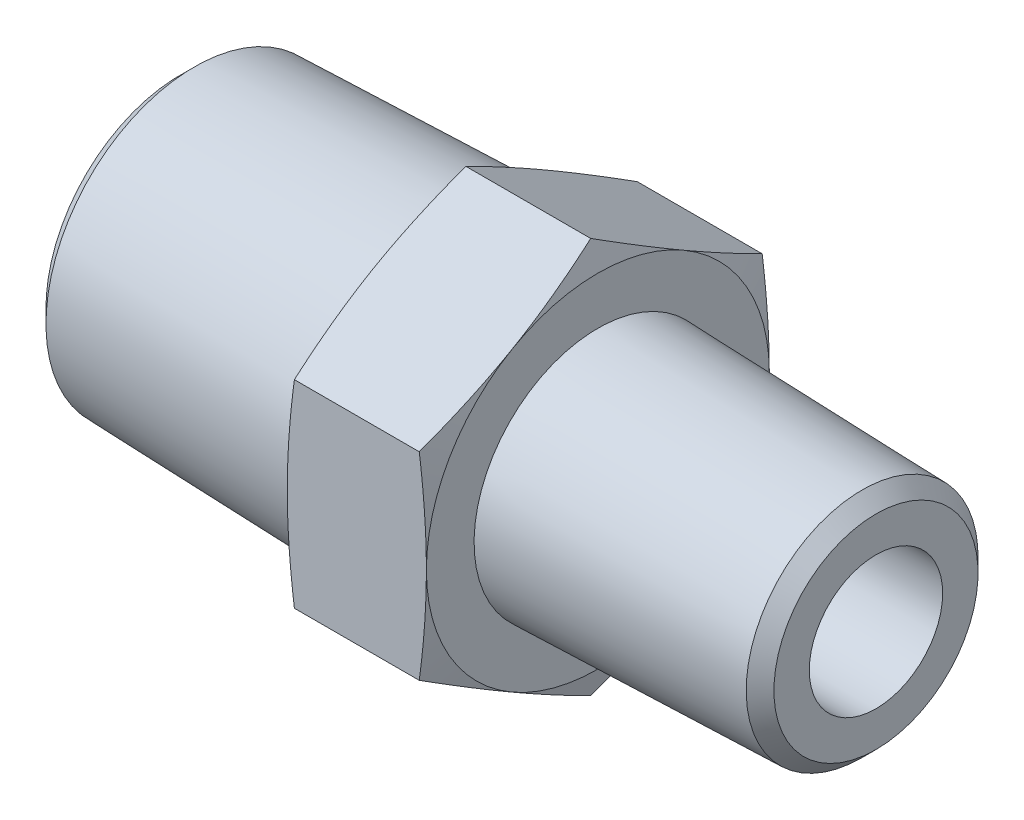
ISO-10303-21;
HEADER;
FILE_DESCRIPTION(('STEP AP214'),'2;1');
FILE_NAME('part.step','',(''),(''),'','','');
FILE_SCHEMA(('AUTOMOTIVE_DESIGN { 1 0 10303 214 1 1 1 1 }'));
ENDSEC;
DATA;
#1=APPLICATION_CONTEXT('core data for automotive mechanical design processes');
#2=APPLICATION_PROTOCOL_DEFINITION('international standard','automotive_design',2000,#1);
#3=PRODUCT_CONTEXT('',#1,'mechanical');
#4=PRODUCT('Part','Part','',(#3));
#5=PRODUCT_RELATED_PRODUCT_CATEGORY('part','',(#4));
#6=PRODUCT_DEFINITION_FORMATION('','',#4);
#7=PRODUCT_DEFINITION_CONTEXT('part definition',#1,'design');
#8=PRODUCT_DEFINITION('design','',#6,#7);
#9=PRODUCT_DEFINITION_SHAPE('','',#8);
#10=(LENGTH_UNIT() NAMED_UNIT(*) SI_UNIT(.MILLI.,.METRE.));
#11=(NAMED_UNIT(*) PLANE_ANGLE_UNIT() SI_UNIT($,.RADIAN.));
#12=(NAMED_UNIT(*) SI_UNIT($,.STERADIAN.) SOLID_ANGLE_UNIT());
#13=UNCERTAINTY_MEASURE_WITH_UNIT(LENGTH_MEASURE(1.E-05),#10,'distance_accuracy_value','');
#14=(GEOMETRIC_REPRESENTATION_CONTEXT(3) GLOBAL_UNCERTAINTY_ASSIGNED_CONTEXT((#13)) GLOBAL_UNIT_ASSIGNED_CONTEXT((#10,
#11,#12)) REPRESENTATION_CONTEXT('',''));
#15=CARTESIAN_POINT('',(0.,0.,0.));
#16=DIRECTION('',(0.,0.,1.));
#17=DIRECTION('',(1.,0.,0.));
#18=AXIS2_PLACEMENT_3D('',#15,#16,#17);
#19=CARTESIAN_POINT('',(-18.25,3.8862625,0.));
#20=DIRECTION('',(-1.,0.,0.));
#21=DIRECTION('',(0.,1.,0.));
#22=AXIS2_PLACEMENT_3D('',#19,#20,#21);
#23=PLANE('',#22);
#24=CARTESIAN_POINT('',(-18.25,0.,0.));
#25=DIRECTION('',(-1.,0.,0.));
#26=DIRECTION('',(0.,1.,0.));
#27=AXIS2_PLACEMENT_3D('',#24,#25,#26);
#28=CIRCLE('',#27,7.06697);
#29=CARTESIAN_POINT('',(-18.25,-7.06697,0.));
#30=VERTEX_POINT('',#29);
#31=EDGE_CURVE('E201',#30,#30,#28,.T.);
#32=ORIENTED_EDGE('',*,*,#31,.T.);
#33=EDGE_LOOP('',(#32));
#34=FACE_BOUND('',#33,.T.);
#35=CARTESIAN_POINT('',(-18.25,0.,0.));
#36=DIRECTION('',(1.,0.,0.));
#37=DIRECTION('',(0.,1.,0.));
#38=AXIS2_PLACEMENT_3D('',#35,#36,#37);
#39=CIRCLE('',#38,4.75);
#40=CARTESIAN_POINT('',(-18.25,-4.75,0.));
#41=VERTEX_POINT('',#40);
#42=EDGE_CURVE('E242',#41,#41,#39,.T.);
#43=ORIENTED_EDGE('',*,*,#42,.T.);
#44=EDGE_LOOP('',(#43));
#45=FACE_BOUND('',#44,.T.);
#46=ADVANCED_FACE('F15',(#34,#45),#23,.T.);
#47=CARTESIAN_POINT('',(-10.912228,0.,0.));
#48=DIRECTION('',(1.,0.,0.));
#49=DIRECTION('',(0.,1.,0.));
#50=AXIS2_PLACEMENT_3D('',#47,#48,#49);
#51=CONICAL_SURFACE('',#50,8.001830375,0.0312398334302684);
#52=CARTESIAN_POINT('',(-3.65,0.,0.));
#53=DIRECTION('',(-1.,0.,0.));
#54=DIRECTION('',(0.,1.,0.));
#55=AXIS2_PLACEMENT_3D('',#52,#53,#54);
#56=CIRCLE('',#55,8.228775);
#57=CARTESIAN_POINT('',(-3.65,-8.228775,0.));
#58=VERTEX_POINT('',#57);
#59=EDGE_CURVE('E375',#58,#58,#56,.T.);
#60=ORIENTED_EDGE('',*,*,#59,.T.);
#61=EDGE_LOOP('',(#60));
#62=FACE_BOUND('',#61,.T.);
#63=CARTESIAN_POINT('',(-17.5216851612903,0.,0.));
#64=DIRECTION('',(1.,0.,0.));
#65=DIRECTION('',(0.,1.,0.));
#66=AXIS2_PLACEMENT_3D('',#63,#64,#65);
#67=CIRCLE('',#66,7.79528483870968);
#68=CARTESIAN_POINT('',(-17.5216851612903,-7.79528483870968,0.));
#69=VERTEX_POINT('',#68);
#70=EDGE_CURVE('E161',#69,#69,#67,.T.);
#71=ORIENTED_EDGE('',*,*,#70,.T.);
#72=EDGE_LOOP('',(#71));
#73=FACE_BOUND('',#72,.T.);
#74=ADVANCED_FACE('F515',(#62,#73),#51,.T.);
#75=CARTESIAN_POINT('',(-4.65,-7.79422863405995,-4.5));
#76=DIRECTION('',(0.,-0.866025403784439,-0.5));
#77=DIRECTION('',(0.,0.5,-0.866025403784439));
#78=AXIS2_PLACEMENT_3D('',#75,#76,#77);
#79=PLANE('',#78);
#80=CARTESIAN_POINT('',(-3.27621087655858,-5.19345831548124,-9.00466633059542));
#81=CARTESIAN_POINT('',(-3.65,-6.58737465792135,-6.59033240398856));
#82=CARTESIAN_POINT('',(-3.65,-7.79422863405995,-4.5));
#83=CARTESIAN_POINT('',(-3.65,-9.00108261019855,-2.40966759601143));
#84=CARTESIAN_POINT('',(-3.27621087655858,-10.3949989526387,0.00466633059542202));
#85=(BOUNDED_CURVE() B_SPLINE_CURVE(2,(#80,#81,#82,#83,#84),.UNSPECIFIED.,.F.,
.F.) B_SPLINE_CURVE_WITH_KNOTS((3,2,3),(0.,5.21793533208069,10.4358706641614),
.UNSPECIFIED.) CURVE() GEOMETRIC_REPRESENTATION_ITEM() RATIONAL_B_SPLINE_CURVE((1.,
1.03802697460133,1.,1.03802697460135,1.)) REPRESENTATION_ITEM(''));
#86=CARTESIAN_POINT('',(-3.27693304105358,-5.19615242270663,-9.));
#87=VERTEX_POINT('',#86);
#88=CARTESIAN_POINT('',(-3.65,-7.79422863405995,-4.5));
#89=VERTEX_POINT('',#88);
#90=EDGE_CURVE('E128',#87,#89,#85,.T.);
#91=ORIENTED_EDGE('',*,*,#90,.F.);
#92=DIRECTION('',(1.,0.,0.));
#93=VECTOR('',#92,1.);
#94=CARTESIAN_POINT('',(-4.65,-5.19615242270663,-9.));
#95=LINE('',#94,#93);
#96=CARTESIAN_POINT('',(3.27693304105358,-5.19615242270663,-9.));
#97=VERTEX_POINT('',#96);
#98=EDGE_CURVE('E9',#87,#97,#95,.T.);
#99=ORIENTED_EDGE('',*,*,#98,.T.);
#100=CARTESIAN_POINT('',(3.27621087655858,-10.3949989526387,0.00466633059542582));
#101=CARTESIAN_POINT('',(3.65,-9.00108261019854,-2.40966759601143));
#102=CARTESIAN_POINT('',(3.65,-7.79422863405995,-4.5));
#103=CARTESIAN_POINT('',(3.65,-6.58737465792135,-6.59033240398856));
#104=CARTESIAN_POINT('',(3.27621087655858,-5.19345831548124,-9.00466633059542));
#105=(BOUNDED_CURVE() B_SPLINE_CURVE(2,(#100,#101,#102,#103,#104),.UNSPECIFIED.,.F.,
.F.) B_SPLINE_CURVE_WITH_KNOTS((3,2,3),(0.,5.21793533208069,10.4358706641614),
.UNSPECIFIED.) CURVE() GEOMETRIC_REPRESENTATION_ITEM() RATIONAL_B_SPLINE_CURVE((1.,
1.03802697460134,1.,1.03802697460134,1.)) REPRESENTATION_ITEM(''));
#106=CARTESIAN_POINT('',(3.65,-7.79422863405995,-4.5));
#107=VERTEX_POINT('',#106);
#108=EDGE_CURVE('E225',#107,#97,#105,.T.);
#109=ORIENTED_EDGE('',*,*,#108,.F.);
#110=CARTESIAN_POINT('',(3.27621087655858,-10.3949989526387,0.00466633059542582));
#111=CARTESIAN_POINT('',(3.65,-9.00108261019854,-2.40966759601143));
#112=CARTESIAN_POINT('',(3.65,-7.79422863405995,-4.5));
#113=CARTESIAN_POINT('',(3.65,-6.58737465792135,-6.59033240398856));
#114=CARTESIAN_POINT('',(3.27621087655858,-5.19345831548124,-9.00466633059542));
#115=(BOUNDED_CURVE() B_SPLINE_CURVE(2,(#110,#111,#112,#113,#114),.UNSPECIFIED.,.F.,
.F.) B_SPLINE_CURVE_WITH_KNOTS((3,2,3),(0.,5.21793533208069,10.4358706641614),
.UNSPECIFIED.) CURVE() GEOMETRIC_REPRESENTATION_ITEM() RATIONAL_B_SPLINE_CURVE((1.,
1.03802697460134,1.,1.03802697460134,1.)) REPRESENTATION_ITEM(''));
#116=CARTESIAN_POINT('',(3.27693304105358,-10.3923048454133,0.));
#117=VERTEX_POINT('',#116);
#118=EDGE_CURVE('E252',#117,#107,#115,.T.);
#119=ORIENTED_EDGE('',*,*,#118,.F.);
#120=DIRECTION('',(1.,0.,0.));
#121=VECTOR('',#120,1.);
#122=CARTESIAN_POINT('',(-4.65,-10.3923048454133,0.));
#123=LINE('',#122,#121);
#124=CARTESIAN_POINT('',(-3.27693304105358,-10.3923048454133,0.));
#125=VERTEX_POINT('',#124);
#126=EDGE_CURVE('E304',#125,#117,#123,.T.);
#127=ORIENTED_EDGE('',*,*,#126,.F.);
#128=CARTESIAN_POINT('',(-3.27621087655858,-5.19345831548124,-9.00466633059542));
#129=CARTESIAN_POINT('',(-3.65,-6.58737465792135,-6.59033240398856));
#130=CARTESIAN_POINT('',(-3.65,-7.79422863405995,-4.5));
#131=CARTESIAN_POINT('',(-3.65,-9.00108261019855,-2.40966759601143));
#132=CARTESIAN_POINT('',(-3.27621087655858,-10.3949989526387,0.00466633059542202));
#133=(BOUNDED_CURVE() B_SPLINE_CURVE(2,(#128,#129,#130,#131,#132),.UNSPECIFIED.,.F.,
.F.) B_SPLINE_CURVE_WITH_KNOTS((3,2,3),(0.,5.21793533208069,10.4358706641614),
.UNSPECIFIED.) CURVE() GEOMETRIC_REPRESENTATION_ITEM() RATIONAL_B_SPLINE_CURVE((1.,
1.03802697460133,1.,1.03802697460135,1.)) REPRESENTATION_ITEM(''));
#134=EDGE_CURVE('E131',#89,#125,#133,.T.);
#135=ORIENTED_EDGE('',*,*,#134,.F.);
#136=EDGE_LOOP('',(#91,#99,#109,#119,#127,#135));
#137=FACE_BOUND('',#136,.T.);
#138=ADVANCED_FACE('F129',(#137),#79,.T.);
#139=CARTESIAN_POINT('',(-4.65,0.,-9.));
#140=DIRECTION('',(0.,0.,-1.));
#141=DIRECTION('',(0.,1.,0.));
#142=AXIS2_PLACEMENT_3D('',#139,#140,#141);
#143=PLANE('',#142);
#144=CARTESIAN_POINT('',(-3.27621087655858,5.20154063715742,-9.));
#145=CARTESIAN_POINT('',(-3.65,2.41370795227722,-9.));
#146=CARTESIAN_POINT('',(-3.65,0.,-9.));
#147=CARTESIAN_POINT('',(-3.65,-2.41370795227722,-9.));
#148=CARTESIAN_POINT('',(-3.27621087655858,-5.20154063715742,-9.));
#149=(BOUNDED_CURVE() B_SPLINE_CURVE(2,(#144,#145,#146,#147,#148),.UNSPECIFIED.,.F.,
.F.) B_SPLINE_CURVE_WITH_KNOTS((3,2,3),(0.,5.21793533208069,10.4358706641614),
.UNSPECIFIED.) CURVE() GEOMETRIC_REPRESENTATION_ITEM() RATIONAL_B_SPLINE_CURVE((1.,
1.03802697460135,1.,1.03802697460135,1.)) REPRESENTATION_ITEM(''));
#150=CARTESIAN_POINT('',(-3.27693304105358,5.19615242270663,-9.));
#151=VERTEX_POINT('',#150);
#152=CARTESIAN_POINT('',(-3.65,0.,-9.));
#153=VERTEX_POINT('',#152);
#154=EDGE_CURVE('E19',#151,#153,#149,.T.);
#155=ORIENTED_EDGE('',*,*,#154,.F.);
#156=DIRECTION('',(1.,0.,0.));
#157=VECTOR('',#156,1.);
#158=CARTESIAN_POINT('',(-4.65,5.19615242270663,-9.));
#159=LINE('',#158,#157);
#160=CARTESIAN_POINT('',(3.27693304105358,5.19615242270663,-9.));
#161=VERTEX_POINT('',#160);
#162=EDGE_CURVE('E28',#151,#161,#159,.T.);
#163=ORIENTED_EDGE('',*,*,#162,.T.);
#164=CARTESIAN_POINT('',(3.27621087655858,-5.20154063715742,-9.));
#165=CARTESIAN_POINT('',(3.65,-2.41370795227725,-9.));
#166=CARTESIAN_POINT('',(3.65,0.,-9.));
#167=CARTESIAN_POINT('',(3.65,2.41370795227726,-9.));
#168=CARTESIAN_POINT('',(3.27621087655858,5.20154063715742,-9.));
#169=(BOUNDED_CURVE() B_SPLINE_CURVE(2,(#164,#165,#166,#167,#168),.UNSPECIFIED.,.F.,
.F.) B_SPLINE_CURVE_WITH_KNOTS((3,2,3),(0.,5.21793533208069,10.4358706641614),
.UNSPECIFIED.) CURVE() GEOMETRIC_REPRESENTATION_ITEM() RATIONAL_B_SPLINE_CURVE((1.,
1.03802697460132,1.,1.03802697460132,1.)) REPRESENTATION_ITEM(''));
#170=CARTESIAN_POINT('',(3.65,0.,-9.));
#171=VERTEX_POINT('',#170);
#172=EDGE_CURVE('E219',#171,#161,#169,.T.);
#173=ORIENTED_EDGE('',*,*,#172,.F.);
#174=CARTESIAN_POINT('',(3.27621087655858,-5.20154063715742,-9.));
#175=CARTESIAN_POINT('',(3.65,-2.41370795227725,-9.));
#176=CARTESIAN_POINT('',(3.65,0.,-9.));
#177=CARTESIAN_POINT('',(3.65,2.41370795227726,-9.));
#178=CARTESIAN_POINT('',(3.27621087655858,5.20154063715742,-9.));
#179=(BOUNDED_CURVE() B_SPLINE_CURVE(2,(#174,#175,#176,#177,#178),.UNSPECIFIED.,.F.,
.F.) B_SPLINE_CURVE_WITH_KNOTS((3,2,3),(0.,5.21793533208069,10.4358706641614),
.UNSPECIFIED.) CURVE() GEOMETRIC_REPRESENTATION_ITEM() RATIONAL_B_SPLINE_CURVE((1.,
1.03802697460132,1.,1.03802697460132,1.)) REPRESENTATION_ITEM(''));
#180=EDGE_CURVE('E125',#97,#171,#179,.T.);
#181=ORIENTED_EDGE('',*,*,#180,.F.);
#182=ORIENTED_EDGE('',*,*,#98,.F.);
#183=CARTESIAN_POINT('',(-3.27621087655858,5.20154063715742,-9.));
#184=CARTESIAN_POINT('',(-3.65,2.41370795227722,-9.));
#185=CARTESIAN_POINT('',(-3.65,0.,-9.));
#186=CARTESIAN_POINT('',(-3.65,-2.41370795227722,-9.));
#187=CARTESIAN_POINT('',(-3.27621087655858,-5.20154063715742,-9.));
#188=(BOUNDED_CURVE() B_SPLINE_CURVE(2,(#183,#184,#185,#186,#187),.UNSPECIFIED.,.F.,
.F.) B_SPLINE_CURVE_WITH_KNOTS((3,2,3),(0.,5.21793533208069,10.4358706641614),
.UNSPECIFIED.) CURVE() GEOMETRIC_REPRESENTATION_ITEM() RATIONAL_B_SPLINE_CURVE((1.,
1.03802697460135,1.,1.03802697460135,1.)) REPRESENTATION_ITEM(''));
#189=EDGE_CURVE('E121',#153,#87,#188,.T.);
#190=ORIENTED_EDGE('',*,*,#189,.F.);
#191=EDGE_LOOP('',(#155,#163,#173,#181,#182,#190));
#192=FACE_BOUND('',#191,.T.);
#193=ADVANCED_FACE('F119',(#192),#143,.T.);
#194=CARTESIAN_POINT('',(-4.65,7.79422863405995,-4.5));
#195=DIRECTION('',(0.,0.866025403784439,-0.5));
#196=DIRECTION('',(0.,0.5,0.866025403784439));
#197=AXIS2_PLACEMENT_3D('',#194,#195,#196);
#198=PLANE('',#197);
#199=CARTESIAN_POINT('',(-3.27621087655858,10.3949989526387,0.00466633059542011));
#200=CARTESIAN_POINT('',(-3.65,9.00108261019854,-2.40966759601143));
#201=CARTESIAN_POINT('',(-3.65,7.79422863405994,-4.5));
#202=CARTESIAN_POINT('',(-3.65000000000001,6.58737465792135,-6.59033240398858));
#203=CARTESIAN_POINT('',(-3.27621087655858,5.19345831548123,-9.00466633059543));
#204=(BOUNDED_CURVE() B_SPLINE_CURVE(2,(#199,#200,#201,#202,#203),.UNSPECIFIED.,.F.,
.F.) B_SPLINE_CURVE_WITH_KNOTS((3,2,3),(0.,5.21793533208069,10.4358706641614),
.UNSPECIFIED.) CURVE() GEOMETRIC_REPRESENTATION_ITEM() RATIONAL_B_SPLINE_CURVE((1.,
1.03802697460135,1.,1.03802697460134,1.)) REPRESENTATION_ITEM(''));
#205=CARTESIAN_POINT('',(-3.27693304105358,10.3923048454133,0.));
#206=VERTEX_POINT('',#205);
#207=CARTESIAN_POINT('',(-3.65,7.79422863405994,-4.5));
#208=VERTEX_POINT('',#207);
#209=EDGE_CURVE('E199',#206,#208,#204,.T.);
#210=ORIENTED_EDGE('',*,*,#209,.F.);
#211=DIRECTION('',(1.,0.,0.));
#212=VECTOR('',#211,1.);
#213=CARTESIAN_POINT('',(-4.65,10.3923048454133,0.));
#214=LINE('',#213,#212);
#215=CARTESIAN_POINT('',(3.27693304105358,10.3923048454133,0.));
#216=VERTEX_POINT('',#215);
#217=EDGE_CURVE('E237',#206,#216,#214,.T.);
#218=ORIENTED_EDGE('',*,*,#217,.T.);
#219=CARTESIAN_POINT('',(3.27621087655858,5.19345831548123,-9.00466633059542));
#220=CARTESIAN_POINT('',(3.65,6.58737465792135,-6.59033240398857));
#221=CARTESIAN_POINT('',(3.65,7.79422863405994,-4.5));
#222=CARTESIAN_POINT('',(3.65,9.00108261019853,-2.40966759601143));
#223=CARTESIAN_POINT('',(3.27621087655858,10.3949989526387,0.00466633059542106));
#224=(BOUNDED_CURVE() B_SPLINE_CURVE(2,(#219,#220,#221,#222,#223),.UNSPECIFIED.,.F.,
.F.) B_SPLINE_CURVE_WITH_KNOTS((3,2,3),(0.,5.21793533208069,10.4358706641614),
.UNSPECIFIED.) CURVE() GEOMETRIC_REPRESENTATION_ITEM() RATIONAL_B_SPLINE_CURVE((1.,
1.03802697460135,1.,1.03802697460135,1.)) REPRESENTATION_ITEM(''));
#225=CARTESIAN_POINT('',(3.65,7.79422863405995,-4.5));
#226=VERTEX_POINT('',#225);
#227=EDGE_CURVE('E189',#226,#216,#224,.T.);
#228=ORIENTED_EDGE('',*,*,#227,.F.);
#229=CARTESIAN_POINT('',(3.27621087655858,5.19345831548123,-9.00466633059542));
#230=CARTESIAN_POINT('',(3.65,6.58737465792135,-6.59033240398857));
#231=CARTESIAN_POINT('',(3.65,7.79422863405994,-4.5));
#232=CARTESIAN_POINT('',(3.65,9.00108261019853,-2.40966759601143));
#233=CARTESIAN_POINT('',(3.27621087655858,10.3949989526387,0.00466633059542106));
#234=(BOUNDED_CURVE() B_SPLINE_CURVE(2,(#229,#230,#231,#232,#233),.UNSPECIFIED.,.F.,
.F.) B_SPLINE_CURVE_WITH_KNOTS((3,2,3),(0.,5.21793533208069,10.4358706641614),
.UNSPECIFIED.) CURVE() GEOMETRIC_REPRESENTATION_ITEM() RATIONAL_B_SPLINE_CURVE((1.,
1.03802697460135,1.,1.03802697460135,1.)) REPRESENTATION_ITEM(''));
#235=EDGE_CURVE('E178',#161,#226,#234,.T.);
#236=ORIENTED_EDGE('',*,*,#235,.F.);
#237=ORIENTED_EDGE('',*,*,#162,.F.);
#238=CARTESIAN_POINT('',(-3.27621087655858,10.3949989526387,0.00466633059542011));
#239=CARTESIAN_POINT('',(-3.65,9.00108261019854,-2.40966759601143));
#240=CARTESIAN_POINT('',(-3.65,7.79422863405994,-4.5));
#241=CARTESIAN_POINT('',(-3.65000000000001,6.58737465792135,-6.59033240398858));
#242=CARTESIAN_POINT('',(-3.27621087655858,5.19345831548123,-9.00466633059543));
#243=(BOUNDED_CURVE() B_SPLINE_CURVE(2,(#238,#239,#240,#241,#242),.UNSPECIFIED.,.F.,
.F.) B_SPLINE_CURVE_WITH_KNOTS((3,2,3),(0.,5.21793533208069,10.4358706641614),
.UNSPECIFIED.) CURVE() GEOMETRIC_REPRESENTATION_ITEM() RATIONAL_B_SPLINE_CURVE((1.,
1.03802697460135,1.,1.03802697460134,1.)) REPRESENTATION_ITEM(''));
#244=EDGE_CURVE('E144',#208,#151,#243,.T.);
#245=ORIENTED_EDGE('',*,*,#244,.F.);
#246=EDGE_LOOP('',(#210,#218,#228,#236,#237,#245));
#247=FACE_BOUND('',#246,.T.);
#248=ADVANCED_FACE('F562',(#247),#198,.T.);
#249=CARTESIAN_POINT('',(-4.65,-7.79422863405995,4.5));
#250=DIRECTION('',(0.,-0.866025403784439,0.5));
#251=DIRECTION('',(0.,-0.5,-0.866025403784439));
#252=AXIS2_PLACEMENT_3D('',#249,#250,#251);
#253=PLANE('',#252);
#254=CARTESIAN_POINT('',(-3.27621087655858,-10.3949989526387,-0.00466633059541821));
#255=CARTESIAN_POINT('',(-3.65,-9.00108261019856,2.4096675960114));
#256=CARTESIAN_POINT('',(-3.65,-7.79422863405995,4.5));
#257=CARTESIAN_POINT('',(-3.65,-6.58737465792133,6.5903324039886));
#258=CARTESIAN_POINT('',(-3.27621087655858,-5.19345831548124,9.00466633059542));
#259=(BOUNDED_CURVE() B_SPLINE_CURVE(2,(#254,#255,#256,#257,#258),.UNSPECIFIED.,.F.,
.F.) B_SPLINE_CURVE_WITH_KNOTS((3,2,3),(0.,5.21793533208069,10.4358706641614),
.UNSPECIFIED.) CURVE() GEOMETRIC_REPRESENTATION_ITEM() RATIONAL_B_SPLINE_CURVE((1.,
1.03802697460135,1.,1.03802697460134,1.)) REPRESENTATION_ITEM(''));
#260=CARTESIAN_POINT('',(-3.65,-7.79422863405995,4.5));
#261=VERTEX_POINT('',#260);
#262=CARTESIAN_POINT('',(-3.27693304105358,-5.19615242270663,9.));
#263=VERTEX_POINT('',#262);
#264=EDGE_CURVE('E299',#261,#263,#259,.T.);
#265=ORIENTED_EDGE('',*,*,#264,.F.);
#266=CARTESIAN_POINT('',(-3.27621087655858,-10.3949989526387,-0.00466633059541821));
#267=CARTESIAN_POINT('',(-3.65,-9.00108261019856,2.4096675960114));
#268=CARTESIAN_POINT('',(-3.65,-7.79422863405995,4.5));
#269=CARTESIAN_POINT('',(-3.65,-6.58737465792133,6.5903324039886));
#270=CARTESIAN_POINT('',(-3.27621087655858,-5.19345831548124,9.00466633059542));
#271=(BOUNDED_CURVE() B_SPLINE_CURVE(2,(#266,#267,#268,#269,#270),.UNSPECIFIED.,.F.,
.F.) B_SPLINE_CURVE_WITH_KNOTS((3,2,3),(0.,5.21793533208069,10.4358706641614),
.UNSPECIFIED.) CURVE() GEOMETRIC_REPRESENTATION_ITEM() RATIONAL_B_SPLINE_CURVE((1.,
1.03802697460135,1.,1.03802697460134,1.)) REPRESENTATION_ITEM(''));
#272=EDGE_CURVE('E170',#125,#261,#271,.T.);
#273=ORIENTED_EDGE('',*,*,#272,.F.);
#274=ORIENTED_EDGE('',*,*,#126,.T.);
#275=CARTESIAN_POINT('',(3.27621087655858,-5.19345831548123,9.00466633059542));
#276=CARTESIAN_POINT('',(3.65000000000001,-6.58737465792134,6.5903324039886));
#277=CARTESIAN_POINT('',(3.65,-7.79422863405995,4.5));
#278=CARTESIAN_POINT('',(3.65,-9.00108261019855,2.4096675960114));
#279=CARTESIAN_POINT('',(3.27621087655858,-10.3949989526387,-0.00466633059542392));
#280=(BOUNDED_CURVE() B_SPLINE_CURVE(2,(#275,#276,#277,#278,#279),.UNSPECIFIED.,.F.,
.F.) B_SPLINE_CURVE_WITH_KNOTS((3,2,3),(0.,5.21793533208069,10.4358706641614),
.UNSPECIFIED.) CURVE() GEOMETRIC_REPRESENTATION_ITEM() RATIONAL_B_SPLINE_CURVE((1.,
1.03802697460132,1.,1.03802697460133,1.)) REPRESENTATION_ITEM(''));
#281=CARTESIAN_POINT('',(3.65,-7.79422863405995,4.5));
#282=VERTEX_POINT('',#281);
#283=EDGE_CURVE('E246',#282,#117,#280,.T.);
#284=ORIENTED_EDGE('',*,*,#283,.F.);
#285=CARTESIAN_POINT('',(3.27621087655858,-5.19345831548123,9.00466633059542));
#286=CARTESIAN_POINT('',(3.65000000000001,-6.58737465792134,6.5903324039886));
#287=CARTESIAN_POINT('',(3.65,-7.79422863405995,4.5));
#288=CARTESIAN_POINT('',(3.65,-9.00108261019855,2.4096675960114));
#289=CARTESIAN_POINT('',(3.27621087655858,-10.3949989526387,-0.00466633059542392));
#290=(BOUNDED_CURVE() B_SPLINE_CURVE(2,(#285,#286,#287,#288,#289),.UNSPECIFIED.,.F.,
.F.) B_SPLINE_CURVE_WITH_KNOTS((3,2,3),(0.,5.21793533208069,10.4358706641614),
.UNSPECIFIED.) CURVE() GEOMETRIC_REPRESENTATION_ITEM() RATIONAL_B_SPLINE_CURVE((1.,
1.03802697460132,1.,1.03802697460133,1.)) REPRESENTATION_ITEM(''));
#291=CARTESIAN_POINT('',(3.27693304105358,-5.19615242270663,9.));
#292=VERTEX_POINT('',#291);
#293=EDGE_CURVE('E168',#292,#282,#290,.T.);
#294=ORIENTED_EDGE('',*,*,#293,.F.);
#295=DIRECTION('',(1.,0.,0.));
#296=VECTOR('',#295,1.);
#297=CARTESIAN_POINT('',(-4.65,-5.19615242270663,9.));
#298=LINE('',#297,#296);
#299=EDGE_CURVE('E379',#263,#292,#298,.T.);
#300=ORIENTED_EDGE('',*,*,#299,.F.);
#301=EDGE_LOOP('',(#265,#273,#274,#284,#294,#300));
#302=FACE_BOUND('',#301,.T.);
#303=ADVANCED_FACE('F540',(#302),#253,.T.);
#304=CARTESIAN_POINT('',(-4.65,0.,9.));
#305=DIRECTION('',(0.,0.,1.));
#306=DIRECTION('',(0.,-1.,0.));
#307=AXIS2_PLACEMENT_3D('',#304,#305,#306);
#308=PLANE('',#307);
#309=CARTESIAN_POINT('',(-3.27621087655858,-5.20154063715742,9.));
#310=CARTESIAN_POINT('',(-3.65,-2.41370795227726,9.));
#311=CARTESIAN_POINT('',(-3.65,0.,9.));
#312=CARTESIAN_POINT('',(-3.65,2.41370795227727,8.99999999999999));
#313=CARTESIAN_POINT('',(-3.27621087655858,5.20154063715742,9.));
#314=(BOUNDED_CURVE() B_SPLINE_CURVE(2,(#309,#310,#311,#312,#313),.UNSPECIFIED.,.F.,
.F.) B_SPLINE_CURVE_WITH_KNOTS((3,2,3),(0.,5.21793533208069,10.4358706641614),
.UNSPECIFIED.) CURVE() GEOMETRIC_REPRESENTATION_ITEM() RATIONAL_B_SPLINE_CURVE((1.,
1.03802697460134,1.,1.03802697460134,1.)) REPRESENTATION_ITEM(''));
#315=CARTESIAN_POINT('',(-3.65,0.,9.));
#316=VERTEX_POINT('',#315);
#317=CARTESIAN_POINT('',(-3.27693304105358,5.19615242270664,9.));
#318=VERTEX_POINT('',#317);
#319=EDGE_CURVE('E190',#316,#318,#314,.T.);
#320=ORIENTED_EDGE('',*,*,#319,.F.);
#321=CARTESIAN_POINT('',(-3.27621087655858,-5.20154063715742,9.));
#322=CARTESIAN_POINT('',(-3.65,-2.41370795227726,9.));
#323=CARTESIAN_POINT('',(-3.65,0.,9.));
#324=CARTESIAN_POINT('',(-3.65,2.41370795227727,8.99999999999999));
#325=CARTESIAN_POINT('',(-3.27621087655858,5.20154063715742,9.));
#326=(BOUNDED_CURVE() B_SPLINE_CURVE(2,(#321,#322,#323,#324,#325),.UNSPECIFIED.,.F.,
.F.) B_SPLINE_CURVE_WITH_KNOTS((3,2,3),(0.,5.21793533208069,10.4358706641614),
.UNSPECIFIED.) CURVE() GEOMETRIC_REPRESENTATION_ITEM() RATIONAL_B_SPLINE_CURVE((1.,
1.03802697460134,1.,1.03802697460134,1.)) REPRESENTATION_ITEM(''));
#327=EDGE_CURVE('E149',#263,#316,#326,.T.);
#328=ORIENTED_EDGE('',*,*,#327,.F.);
#329=ORIENTED_EDGE('',*,*,#299,.T.);
#330=CARTESIAN_POINT('',(3.27621087655858,5.20154063715743,9.));
#331=CARTESIAN_POINT('',(3.65,2.41370795227726,9.));
#332=CARTESIAN_POINT('',(3.65,0.,9.));
#333=CARTESIAN_POINT('',(3.65,-2.41370795227725,9.));
#334=CARTESIAN_POINT('',(3.27621087655858,-5.20154063715743,9.));
#335=(BOUNDED_CURVE() B_SPLINE_CURVE(2,(#330,#331,#332,#333,#334),.UNSPECIFIED.,.F.,
.F.) B_SPLINE_CURVE_WITH_KNOTS((3,2,3),(0.,5.21793533208069,10.4358706641614),
.UNSPECIFIED.) CURVE() GEOMETRIC_REPRESENTATION_ITEM() RATIONAL_B_SPLINE_CURVE((1.,
1.03802697460133,1.,1.03802697460134,1.)) REPRESENTATION_ITEM(''));
#336=CARTESIAN_POINT('',(3.65,0.,9.));
#337=VERTEX_POINT('',#336);
#338=EDGE_CURVE('E162',#337,#292,#335,.T.);
#339=ORIENTED_EDGE('',*,*,#338,.F.);
#340=CARTESIAN_POINT('',(3.27621087655858,5.20154063715743,9.));
#341=CARTESIAN_POINT('',(3.65,2.41370795227726,9.));
#342=CARTESIAN_POINT('',(3.65,0.,9.));
#343=CARTESIAN_POINT('',(3.65,-2.41370795227725,9.));
#344=CARTESIAN_POINT('',(3.27621087655858,-5.20154063715743,9.));
#345=(BOUNDED_CURVE() B_SPLINE_CURVE(2,(#340,#341,#342,#343,#344),.UNSPECIFIED.,.F.,
.F.) B_SPLINE_CURVE_WITH_KNOTS((3,2,3),(0.,5.21793533208069,10.4358706641614),
.UNSPECIFIED.) CURVE() GEOMETRIC_REPRESENTATION_ITEM() RATIONAL_B_SPLINE_CURVE((1.,
1.03802697460133,1.,1.03802697460134,1.)) REPRESENTATION_ITEM(''));
#346=CARTESIAN_POINT('',(3.27693304105358,5.19615242270664,9.));
#347=VERTEX_POINT('',#346);
#348=EDGE_CURVE('E179',#347,#337,#345,.T.);
#349=ORIENTED_EDGE('',*,*,#348,.F.);
#350=DIRECTION('',(1.,0.,0.));
#351=VECTOR('',#350,1.);
#352=CARTESIAN_POINT('',(-4.65,5.19615242270664,9.));
#353=LINE('',#352,#351);
#354=EDGE_CURVE('E234',#318,#347,#353,.T.);
#355=ORIENTED_EDGE('',*,*,#354,.F.);
#356=EDGE_LOOP('',(#320,#328,#329,#339,#349,#355));
#357=FACE_BOUND('',#356,.T.);
#358=ADVANCED_FACE('F464',(#357),#308,.T.);
#359=CARTESIAN_POINT('',(-4.65,7.79422863405995,4.5));
#360=DIRECTION('',(0.,0.866025403784439,0.5));
#361=DIRECTION('',(0.,-0.5,0.866025403784439));
#362=AXIS2_PLACEMENT_3D('',#359,#360,#361);
#363=PLANE('',#362);
#364=CARTESIAN_POINT('',(-3.27621087655858,5.19345831548124,9.00466633059542));
#365=CARTESIAN_POINT('',(-3.65,6.58737465792135,6.5903324039886));
#366=CARTESIAN_POINT('',(-3.65,7.79422863405995,4.5));
#367=CARTESIAN_POINT('',(-3.65,9.00108261019856,2.40966759601141));
#368=CARTESIAN_POINT('',(-3.27621087655858,10.3949989526387,-0.00466633059542392));
#369=(BOUNDED_CURVE() B_SPLINE_CURVE(2,(#364,#365,#366,#367,#368),.UNSPECIFIED.,.F.,
.F.) B_SPLINE_CURVE_WITH_KNOTS((3,2,3),(0.,5.21793533208069,10.4358706641614),
.UNSPECIFIED.) CURVE() GEOMETRIC_REPRESENTATION_ITEM() RATIONAL_B_SPLINE_CURVE((1.,
1.03802697460137,1.,1.03802697460134,1.)) REPRESENTATION_ITEM(''));
#370=CARTESIAN_POINT('',(-3.65,7.79422863405995,4.5));
#371=VERTEX_POINT('',#370);
#372=EDGE_CURVE('E262',#371,#206,#369,.T.);
#373=ORIENTED_EDGE('',*,*,#372,.F.);
#374=CARTESIAN_POINT('',(-3.27621087655858,5.19345831548124,9.00466633059542));
#375=CARTESIAN_POINT('',(-3.65,6.58737465792135,6.5903324039886));
#376=CARTESIAN_POINT('',(-3.65,7.79422863405995,4.5));
#377=CARTESIAN_POINT('',(-3.65,9.00108261019856,2.40966759601141));
#378=CARTESIAN_POINT('',(-3.27621087655858,10.3949989526387,-0.00466633059542392));
#379=(BOUNDED_CURVE() B_SPLINE_CURVE(2,(#374,#375,#376,#377,#378),.UNSPECIFIED.,.F.,
.F.) B_SPLINE_CURVE_WITH_KNOTS((3,2,3),(0.,5.21793533208069,10.4358706641614),
.UNSPECIFIED.) CURVE() GEOMETRIC_REPRESENTATION_ITEM() RATIONAL_B_SPLINE_CURVE((1.,
1.03802697460137,1.,1.03802697460134,1.)) REPRESENTATION_ITEM(''));
#380=EDGE_CURVE('E200',#318,#371,#379,.T.);
#381=ORIENTED_EDGE('',*,*,#380,.F.);
#382=ORIENTED_EDGE('',*,*,#354,.T.);
#383=CARTESIAN_POINT('',(3.27621087655858,10.3949989526387,-0.00466633059542487));
#384=CARTESIAN_POINT('',(3.65,9.00108261019856,2.4096675960114));
#385=CARTESIAN_POINT('',(3.65,7.79422863405995,4.5));
#386=CARTESIAN_POINT('',(3.65,6.58737465792134,6.59033240398859));
#387=CARTESIAN_POINT('',(3.27621087655858,5.19345831548124,9.00466633059542));
#388=(BOUNDED_CURVE() B_SPLINE_CURVE(2,(#383,#384,#385,#386,#387),.UNSPECIFIED.,.F.,
.F.) B_SPLINE_CURVE_WITH_KNOTS((3,2,3),(0.,5.21793533208069,10.4358706641614),
.UNSPECIFIED.) CURVE() GEOMETRIC_REPRESENTATION_ITEM() RATIONAL_B_SPLINE_CURVE((1.,
1.03802697460135,1.,1.03802697460134,1.)) REPRESENTATION_ITEM(''));
#389=CARTESIAN_POINT('',(3.65,7.79422863405995,4.5));
#390=VERTEX_POINT('',#389);
#391=EDGE_CURVE('E169',#390,#347,#388,.T.);
#392=ORIENTED_EDGE('',*,*,#391,.F.);
#393=CARTESIAN_POINT('',(3.27621087655858,10.3949989526387,-0.00466633059542487));
#394=CARTESIAN_POINT('',(3.65,9.00108261019856,2.4096675960114));
#395=CARTESIAN_POINT('',(3.65,7.79422863405995,4.5));
#396=CARTESIAN_POINT('',(3.65,6.58737465792134,6.59033240398859));
#397=CARTESIAN_POINT('',(3.27621087655858,5.19345831548124,9.00466633059542));
#398=(BOUNDED_CURVE() B_SPLINE_CURVE(2,(#393,#394,#395,#396,#397),.UNSPECIFIED.,.F.,
.F.) B_SPLINE_CURVE_WITH_KNOTS((3,2,3),(0.,5.21793533208069,10.4358706641614),
.UNSPECIFIED.) CURVE() GEOMETRIC_REPRESENTATION_ITEM() RATIONAL_B_SPLINE_CURVE((1.,
1.03802697460135,1.,1.03802697460134,1.)) REPRESENTATION_ITEM(''));
#399=EDGE_CURVE('E233',#216,#390,#398,.T.);
#400=ORIENTED_EDGE('',*,*,#399,.F.);
#401=ORIENTED_EDGE('',*,*,#217,.F.);
#402=EDGE_LOOP('',(#373,#381,#382,#392,#400,#401));
#403=FACE_BOUND('',#402,.T.);
#404=ADVANCED_FACE('F429',(#403),#363,.T.);
#405=CARTESIAN_POINT('',(3.65,-4.5,0.));
#406=DIRECTION('',(1.,0.,0.));
#407=DIRECTION('',(0.,-1.,0.));
#408=AXIS2_PLACEMENT_3D('',#405,#406,#407);
#409=PLANE('',#408);
#410=CARTESIAN_POINT('',(3.65,0.,0.));
#411=DIRECTION('',(1.,0.,0.));
#412=DIRECTION('',(0.,-1.,0.));
#413=AXIS2_PLACEMENT_3D('',#410,#411,#412);
#414=CIRCLE('',#413,9.);
#415=EDGE_CURVE('E285',#282,#107,#414,.T.);
#416=ORIENTED_EDGE('',*,*,#415,.T.);
#417=CARTESIAN_POINT('',(3.65,0.,0.));
#418=DIRECTION('',(1.,0.,0.));
#419=DIRECTION('',(0.,-1.,0.));
#420=AXIS2_PLACEMENT_3D('',#417,#418,#419);
#421=CIRCLE('',#420,9.);
#422=EDGE_CURVE('E224',#107,#171,#421,.T.);
#423=ORIENTED_EDGE('',*,*,#422,.T.);
#424=CARTESIAN_POINT('',(3.65,0.,0.));
#425=DIRECTION('',(1.,0.,0.));
#426=DIRECTION('',(0.,-1.,0.));
#427=AXIS2_PLACEMENT_3D('',#424,#425,#426);
#428=CIRCLE('',#427,9.);
#429=EDGE_CURVE('E215',#171,#226,#428,.T.);
#430=ORIENTED_EDGE('',*,*,#429,.T.);
#431=CARTESIAN_POINT('',(3.65,0.,0.));
#432=DIRECTION('',(1.,0.,0.));
#433=DIRECTION('',(0.,-1.,0.));
#434=AXIS2_PLACEMENT_3D('',#431,#432,#433);
#435=CIRCLE('',#434,9.);
#436=EDGE_CURVE('E226',#226,#390,#435,.T.);
#437=ORIENTED_EDGE('',*,*,#436,.T.);
#438=CARTESIAN_POINT('',(3.65,0.,0.));
#439=DIRECTION('',(1.,0.,0.));
#440=DIRECTION('',(0.,-1.,0.));
#441=AXIS2_PLACEMENT_3D('',#438,#439,#440);
#442=CIRCLE('',#441,9.);
#443=EDGE_CURVE('E188',#390,#337,#442,.T.);
#444=ORIENTED_EDGE('',*,*,#443,.T.);
#445=CARTESIAN_POINT('',(3.65,0.,0.));
#446=DIRECTION('',(1.,0.,0.));
#447=DIRECTION('',(0.,-1.,0.));
#448=AXIS2_PLACEMENT_3D('',#445,#446,#447);
#449=CIRCLE('',#448,9.);
#450=EDGE_CURVE('E253',#337,#282,#449,.T.);
#451=ORIENTED_EDGE('',*,*,#450,.T.);
#452=EDGE_LOOP('',(#416,#423,#430,#437,#444,#451));
#453=FACE_BOUND('',#452,.T.);
#454=CARTESIAN_POINT('',(3.65,0.,0.));
#455=DIRECTION('',(-1.,0.,0.));
#456=DIRECTION('',(0.,1.,0.));
#457=AXIS2_PLACEMENT_3D('',#454,#455,#456);
#458=CIRCLE('',#457,6.49598114829396);
#459=CARTESIAN_POINT('',(3.65,-6.49598114829396,0.));
#460=VERTEX_POINT('',#459);
#461=EDGE_CURVE('E271',#460,#460,#458,.T.);
#462=ORIENTED_EDGE('',*,*,#461,.T.);
#463=EDGE_LOOP('',(#462));
#464=FACE_BOUND('',#463,.T.);
#465=ADVANCED_FACE('F344',(#453,#464),#409,.T.);
#466=CARTESIAN_POINT('',(3.4631054382793,0.,0.));
#467=DIRECTION('',(-1.,0.,0.));
#468=DIRECTION('',(0.,-1.,0.));
#469=AXIS2_PLACEMENT_3D('',#466,#467,#468);
#470=CONICAL_SURFACE('',#469,9.6975,1.30899693899575);
#471=ORIENTED_EDGE('',*,*,#108,.T.);
#472=ORIENTED_EDGE('',*,*,#180,.T.);
#473=ORIENTED_EDGE('',*,*,#422,.F.);
#474=EDGE_LOOP('',(#471,#472,#473));
#475=FACE_BOUND('',#474,.T.);
#476=ADVANCED_FACE('F537',(#475),#470,.T.);
#477=CARTESIAN_POINT('',(3.4631054382793,0.,0.));
#478=DIRECTION('',(-1.,0.,0.));
#479=DIRECTION('',(0.,-1.,0.));
#480=AXIS2_PLACEMENT_3D('',#477,#478,#479);
#481=CONICAL_SURFACE('',#480,9.6975,1.30899693899575);
#482=ORIENTED_EDGE('',*,*,#283,.T.);
#483=ORIENTED_EDGE('',*,*,#118,.T.);
#484=ORIENTED_EDGE('',*,*,#415,.F.);
#485=EDGE_LOOP('',(#482,#483,#484));
#486=FACE_BOUND('',#485,.T.);
#487=ADVANCED_FACE('F488',(#486),#481,.T.);
#488=CARTESIAN_POINT('',(3.4631054382793,0.,0.));
#489=DIRECTION('',(-1.,0.,0.));
#490=DIRECTION('',(0.,-1.,0.));
#491=AXIS2_PLACEMENT_3D('',#488,#489,#490);
#492=CONICAL_SURFACE('',#491,9.6975,1.30899693899575);
#493=ORIENTED_EDGE('',*,*,#338,.T.);
#494=ORIENTED_EDGE('',*,*,#293,.T.);
#495=ORIENTED_EDGE('',*,*,#450,.F.);
#496=EDGE_LOOP('',(#493,#494,#495));
#497=FACE_BOUND('',#496,.T.);
#498=ADVANCED_FACE('F525',(#497),#492,.T.);
#499=CARTESIAN_POINT('',(3.4631054382793,0.,0.));
#500=DIRECTION('',(-1.,0.,0.));
#501=DIRECTION('',(0.,-1.,0.));
#502=AXIS2_PLACEMENT_3D('',#499,#500,#501);
#503=CONICAL_SURFACE('',#502,9.6975,1.30899693899575);
#504=ORIENTED_EDGE('',*,*,#348,.T.);
#505=ORIENTED_EDGE('',*,*,#443,.F.);
#506=ORIENTED_EDGE('',*,*,#391,.T.);
#507=EDGE_LOOP('',(#504,#505,#506));
#508=FACE_BOUND('',#507,.T.);
#509=ADVANCED_FACE('F470',(#508),#503,.T.);
#510=CARTESIAN_POINT('',(3.4631054382793,0.,0.));
#511=DIRECTION('',(-1.,0.,0.));
#512=DIRECTION('',(0.,-1.,0.));
#513=AXIS2_PLACEMENT_3D('',#510,#511,#512);
#514=CONICAL_SURFACE('',#513,9.6975,1.30899693899575);
#515=ORIENTED_EDGE('',*,*,#399,.T.);
#516=ORIENTED_EDGE('',*,*,#436,.F.);
#517=ORIENTED_EDGE('',*,*,#227,.T.);
#518=EDGE_LOOP('',(#515,#516,#517));
#519=FACE_BOUND('',#518,.T.);
#520=ADVANCED_FACE('F475',(#519),#514,.T.);
#521=CARTESIAN_POINT('',(3.4631054382793,0.,0.));
#522=DIRECTION('',(-1.,0.,0.));
#523=DIRECTION('',(0.,-1.,0.));
#524=AXIS2_PLACEMENT_3D('',#521,#522,#523);
#525=CONICAL_SURFACE('',#524,9.6975,1.30899693899575);
#526=ORIENTED_EDGE('',*,*,#235,.T.);
#527=ORIENTED_EDGE('',*,*,#429,.F.);
#528=ORIENTED_EDGE('',*,*,#172,.T.);
#529=EDGE_LOOP('',(#526,#527,#528));
#530=FACE_BOUND('',#529,.T.);
#531=ADVANCED_FACE('F544',(#530),#525,.T.);
#532=CARTESIAN_POINT('',(-3.46310543827929,0.,0.));
#533=DIRECTION('',(1.,0.,0.));
#534=DIRECTION('',(0.,-1.,0.));
#535=AXIS2_PLACEMENT_3D('',#532,#533,#534);
#536=CONICAL_SURFACE('',#535,9.6975,1.30899693899575);
#537=ORIENTED_EDGE('',*,*,#134,.T.);
#538=ORIENTED_EDGE('',*,*,#272,.T.);
#539=CARTESIAN_POINT('',(-3.65,0.,0.));
#540=DIRECTION('',(1.,0.,0.));
#541=DIRECTION('',(0.,-1.,0.));
#542=AXIS2_PLACEMENT_3D('',#539,#540,#541);
#543=CIRCLE('',#542,9.);
#544=EDGE_CURVE('E263',#261,#89,#543,.T.);
#545=ORIENTED_EDGE('',*,*,#544,.T.);
#546=EDGE_LOOP('',(#537,#538,#545));
#547=FACE_BOUND('',#546,.T.);
#548=ADVANCED_FACE('F541',(#547),#536,.T.);
#549=CARTESIAN_POINT('',(-3.46310543827929,0.,0.));
#550=DIRECTION('',(1.,0.,0.));
#551=DIRECTION('',(0.,-1.,0.));
#552=AXIS2_PLACEMENT_3D('',#549,#550,#551);
#553=CONICAL_SURFACE('',#552,9.6975,1.30899693899575);
#554=ORIENTED_EDGE('',*,*,#189,.T.);
#555=ORIENTED_EDGE('',*,*,#90,.T.);
#556=CARTESIAN_POINT('',(-3.65,0.,0.));
#557=DIRECTION('',(1.,0.,0.));
#558=DIRECTION('',(0.,-1.,0.));
#559=AXIS2_PLACEMENT_3D('',#556,#557,#558);
#560=CIRCLE('',#559,9.);
#561=EDGE_CURVE('E138',#89,#153,#560,.T.);
#562=ORIENTED_EDGE('',*,*,#561,.T.);
#563=EDGE_LOOP('',(#554,#555,#562));
#564=FACE_BOUND('',#563,.T.);
#565=ADVANCED_FACE('F137',(#564),#553,.T.);
#566=CARTESIAN_POINT('',(-3.46310543827929,0.,0.));
#567=DIRECTION('',(1.,0.,0.));
#568=DIRECTION('',(0.,-1.,0.));
#569=AXIS2_PLACEMENT_3D('',#566,#567,#568);
#570=CONICAL_SURFACE('',#569,9.6975,1.30899693899575);
#571=ORIENTED_EDGE('',*,*,#244,.T.);
#572=ORIENTED_EDGE('',*,*,#154,.T.);
#573=CARTESIAN_POINT('',(-3.65,0.,0.));
#574=DIRECTION('',(1.,0.,0.));
#575=DIRECTION('',(0.,-1.,0.));
#576=AXIS2_PLACEMENT_3D('',#573,#574,#575);
#577=CIRCLE('',#576,9.);
#578=EDGE_CURVE('E213',#153,#208,#577,.T.);
#579=ORIENTED_EDGE('',*,*,#578,.T.);
#580=EDGE_LOOP('',(#571,#572,#579));
#581=FACE_BOUND('',#580,.T.);
#582=ADVANCED_FACE('F421',(#581),#570,.T.);
#583=CARTESIAN_POINT('',(-3.46310543827929,0.,0.));
#584=DIRECTION('',(1.,0.,0.));
#585=DIRECTION('',(0.,-1.,0.));
#586=AXIS2_PLACEMENT_3D('',#583,#584,#585);
#587=CONICAL_SURFACE('',#586,9.6975,1.30899693899575);
#588=ORIENTED_EDGE('',*,*,#209,.T.);
#589=CARTESIAN_POINT('',(-3.65,0.,0.));
#590=DIRECTION('',(1.,0.,0.));
#591=DIRECTION('',(0.,-1.,0.));
#592=AXIS2_PLACEMENT_3D('',#589,#590,#591);
#593=CIRCLE('',#592,9.);
#594=EDGE_CURVE('E209',#208,#371,#593,.T.);
#595=ORIENTED_EDGE('',*,*,#594,.T.);
#596=ORIENTED_EDGE('',*,*,#372,.T.);
#597=EDGE_LOOP('',(#588,#595,#596));
#598=FACE_BOUND('',#597,.T.);
#599=ADVANCED_FACE('F415',(#598),#587,.T.);
#600=CARTESIAN_POINT('',(-3.46310543827929,0.,0.));
#601=DIRECTION('',(1.,0.,0.));
#602=DIRECTION('',(0.,-1.,0.));
#603=AXIS2_PLACEMENT_3D('',#600,#601,#602);
#604=CONICAL_SURFACE('',#603,9.6975,1.30899693899575);
#605=ORIENTED_EDGE('',*,*,#380,.T.);
#606=CARTESIAN_POINT('',(-3.65,0.,0.));
#607=DIRECTION('',(1.,0.,0.));
#608=DIRECTION('',(0.,-1.,0.));
#609=AXIS2_PLACEMENT_3D('',#606,#607,#608);
#610=CIRCLE('',#609,9.);
#611=EDGE_CURVE('E214',#371,#316,#610,.T.);
#612=ORIENTED_EDGE('',*,*,#611,.T.);
#613=ORIENTED_EDGE('',*,*,#319,.T.);
#614=EDGE_LOOP('',(#605,#612,#613));
#615=FACE_BOUND('',#614,.T.);
#616=ADVANCED_FACE('F426',(#615),#604,.T.);
#617=CARTESIAN_POINT('',(-3.46310543827929,0.,0.));
#618=DIRECTION('',(1.,0.,0.));
#619=DIRECTION('',(0.,-1.,0.));
#620=AXIS2_PLACEMENT_3D('',#617,#618,#619);
#621=CONICAL_SURFACE('',#620,9.6975,1.30899693899575);
#622=ORIENTED_EDGE('',*,*,#327,.T.);
#623=CARTESIAN_POINT('',(-3.65,0.,0.));
#624=DIRECTION('',(1.,0.,0.));
#625=DIRECTION('',(0.,-1.,0.));
#626=AXIS2_PLACEMENT_3D('',#623,#624,#625);
#627=CIRCLE('',#626,9.);
#628=EDGE_CURVE('E270',#316,#261,#627,.T.);
#629=ORIENTED_EDGE('',*,*,#628,.T.);
#630=ORIENTED_EDGE('',*,*,#264,.T.);
#631=EDGE_LOOP('',(#622,#629,#630));
#632=FACE_BOUND('',#631,.T.);
#633=ADVANCED_FACE('F461',(#632),#621,.T.);
#634=CARTESIAN_POINT('',(-3.65,-4.5,0.));
#635=DIRECTION('',(-1.,0.,0.));
#636=DIRECTION('',(0.,1.,0.));
#637=AXIS2_PLACEMENT_3D('',#634,#635,#636);
#638=PLANE('',#637);
#639=ORIENTED_EDGE('',*,*,#59,.F.);
#640=EDGE_LOOP('',(#639));
#641=FACE_BOUND('',#640,.T.);
#642=ORIENTED_EDGE('',*,*,#544,.F.);
#643=ORIENTED_EDGE('',*,*,#628,.F.);
#644=ORIENTED_EDGE('',*,*,#611,.F.);
#645=ORIENTED_EDGE('',*,*,#594,.F.);
#646=ORIENTED_EDGE('',*,*,#578,.F.);
#647=ORIENTED_EDGE('',*,*,#561,.F.);
#648=EDGE_LOOP('',(#642,#643,#644,#645,#646,#647));
#649=FACE_BOUND('',#648,.T.);
#650=ADVANCED_FACE('F362',(#641,#649),#638,.T.);
#651=CARTESIAN_POINT('',(18.25,3.0314275,0.));
#652=DIRECTION('',(1.,0.,0.));
#653=DIRECTION('',(0.,1.,0.));
#654=AXIS2_PLACEMENT_3D('',#651,#652,#653);
#655=PLANE('',#654);
#656=CARTESIAN_POINT('',(18.25,0.,0.));
#657=DIRECTION('',(1.,0.,0.));
#658=DIRECTION('',(0.,1.,0.));
#659=AXIS2_PLACEMENT_3D('',#656,#657,#658);
#660=CIRCLE('',#659,5.3573);
#661=CARTESIAN_POINT('',(18.25,-5.3573,0.));
#662=VERTEX_POINT('',#661);
#663=EDGE_CURVE('E153',#662,#662,#660,.T.);
#664=ORIENTED_EDGE('',*,*,#663,.T.);
#665=EDGE_LOOP('',(#664));
#666=FACE_BOUND('',#665,.T.);
#667=CARTESIAN_POINT('',(18.25,0.,0.));
#668=DIRECTION('',(-1.,0.,0.));
#669=DIRECTION('',(0.,1.,0.));
#670=AXIS2_PLACEMENT_3D('',#667,#668,#669);
#671=CIRCLE('',#670,3.5);
#672=CARTESIAN_POINT('',(18.25,-3.5,0.));
#673=VERTEX_POINT('',#672);
#674=EDGE_CURVE('E208',#673,#673,#671,.T.);
#675=ORIENTED_EDGE('',*,*,#674,.T.);
#676=EDGE_LOOP('',(#675));
#677=FACE_BOUND('',#676,.T.);
#678=ADVANCED_FACE('F350',(#666,#677),#655,.T.);
#679=CARTESIAN_POINT('',(10.5204771157621,0.,0.));
#680=DIRECTION('',(-1.,0.,0.));
#681=DIRECTION('',(0.,1.,0.));
#682=AXIS2_PLACEMENT_3D('',#679,#680,#681);
#683=CONICAL_SURFACE('',#682,6.292160375,0.0296574762454795);
#684=ORIENTED_EDGE('',*,*,#461,.F.);
#685=EDGE_LOOP('',(#684));
#686=FACE_BOUND('',#685,.T.);
#687=CARTESIAN_POINT('',(17.5228739517392,0.,0.));
#688=DIRECTION('',(-1.,0.,0.));
#689=DIRECTION('',(0.,1.,0.));
#690=AXIS2_PLACEMENT_3D('',#687,#688,#689);
#691=CIRCLE('',#690,6.08442604826078);
#692=CARTESIAN_POINT('',(17.5228739517392,-6.08442604826078,0.));
#693=VERTEX_POINT('',#692);
#694=EDGE_CURVE('E160',#693,#693,#691,.T.);
#695=ORIENTED_EDGE('',*,*,#694,.T.);
#696=EDGE_LOOP('',(#695));
#697=FACE_BOUND('',#696,.T.);
#698=ADVANCED_FACE('F347',(#686,#697),#683,.T.);
#699=CARTESIAN_POINT('',(17.8972225,0.,0.));
#700=DIRECTION('',(-1.,0.,0.));
#701=DIRECTION('',(0.,1.,0.));
#702=AXIS2_PLACEMENT_3D('',#699,#700,#701);
#703=CONICAL_SURFACE('',#702,5.7100775,0.785398163397448);
#704=ORIENTED_EDGE('',*,*,#694,.F.);
#705=EDGE_LOOP('',(#704));
#706=FACE_BOUND('',#705,.T.);
#707=ORIENTED_EDGE('',*,*,#663,.F.);
#708=EDGE_LOOP('',(#707));
#709=FACE_BOUND('',#708,.T.);
#710=ADVANCED_FACE('F17',(#706,#709),#703,.T.);
#711=CARTESIAN_POINT('',(-17.8972225,0.,0.));
#712=DIRECTION('',(1.,0.,0.));
#713=DIRECTION('',(0.,1.,0.));
#714=AXIS2_PLACEMENT_3D('',#711,#712,#713);
#715=CONICAL_SURFACE('',#714,7.4197475,0.785398163397448);
#716=ORIENTED_EDGE('',*,*,#70,.F.);
#717=EDGE_LOOP('',(#716));
#718=FACE_BOUND('',#717,.T.);
#719=ORIENTED_EDGE('',*,*,#31,.F.);
#720=EDGE_LOOP('',(#719));
#721=FACE_BOUND('',#720,.T.);
#722=ADVANCED_FACE('F356',(#718,#721),#715,.T.);
#723=CARTESIAN_POINT('',(8.57334391824352,0.,0.));
#724=DIRECTION('',(-1.,0.,0.));
#725=DIRECTION('',(0.,1.,0.));
#726=AXIS2_PLACEMENT_3D('',#723,#724,#725);
#727=CYLINDRICAL_SURFACE('',#726,3.5);
#728=CARTESIAN_POINT('',(-2.10331216351297,0.,0.));
#729=DIRECTION('',(1.,0.,0.));
#730=DIRECTION('',(0.,1.,0.));
#731=AXIS2_PLACEMENT_3D('',#728,#729,#730);
#732=CIRCLE('',#731,3.5);
#733=CARTESIAN_POINT('',(-2.10331216351297,3.5,0.));
#734=VERTEX_POINT('',#733);
#735=EDGE_CURVE('E241',#734,#734,#732,.T.);
#736=ORIENTED_EDGE('',*,*,#735,.F.);
#737=EDGE_LOOP('',(#736));
#738=FACE_BOUND('',#737,.T.);
#739=ORIENTED_EDGE('',*,*,#674,.F.);
#740=EDGE_LOOP('',(#739));
#741=FACE_BOUND('',#740,.T.);
#742=ADVANCED_FACE('F499',(#738,#741),#727,.F.);
#743=CARTESIAN_POINT('',(-2.46415608175649,0.,0.));
#744=DIRECTION('',(-1.,0.,0.));
#745=DIRECTION('',(0.,1.,0.));
#746=AXIS2_PLACEMENT_3D('',#743,#744,#745);
#747=CONICAL_SURFACE('',#746,4.125,1.0471975511966);
#748=CARTESIAN_POINT('',(-2.825,0.,0.));
#749=DIRECTION('',(1.,0.,0.));
#750=DIRECTION('',(0.,1.,0.));
#751=AXIS2_PLACEMENT_3D('',#748,#749,#750);
#752=CIRCLE('',#751,4.75);
#753=CARTESIAN_POINT('',(-2.825,4.75,0.));
#754=VERTEX_POINT('',#753);
#755=EDGE_CURVE('E238',#754,#754,#752,.T.);
#756=ORIENTED_EDGE('',*,*,#755,.F.);
#757=EDGE_LOOP('',(#756));
#758=FACE_BOUND('',#757,.T.);
#759=ORIENTED_EDGE('',*,*,#735,.T.);
#760=EDGE_LOOP('',(#759));
#761=FACE_BOUND('',#760,.T.);
#762=ADVANCED_FACE('F497',(#758,#761),#747,.F.);
#763=CARTESIAN_POINT('',(-11.0375,0.,0.));
#764=DIRECTION('',(-1.,0.,0.));
#765=DIRECTION('',(0.,1.,0.));
#766=AXIS2_PLACEMENT_3D('',#763,#764,#765);
#767=CYLINDRICAL_SURFACE('',#766,4.75);
#768=ORIENTED_EDGE('',*,*,#755,.T.);
#769=EDGE_LOOP('',(#768));
#770=FACE_BOUND('',#769,.T.);
#771=ORIENTED_EDGE('',*,*,#42,.F.);
#772=EDGE_LOOP('',(#771));
#773=FACE_BOUND('',#772,.T.);
#774=ADVANCED_FACE('F507',(#770,#773),#767,.F.);
#775=CLOSED_SHELL('',(#46,#74,#138,#193,#248,#303,#358,#404,#465,#476,#487,#498,#509,#520,#531,
#548,#565,#582,#599,#616,#633,#650,#678,#698,#710,#722,#742,#762,#774));
#776=MANIFOLD_SOLID_BREP('B1',#775);
#777=ADVANCED_BREP_SHAPE_REPRESENTATION('',(#18,#776),#14);
#778=SHAPE_DEFINITION_REPRESENTATION(#9,#777);
ENDSEC;
END-ISO-10303-21;
